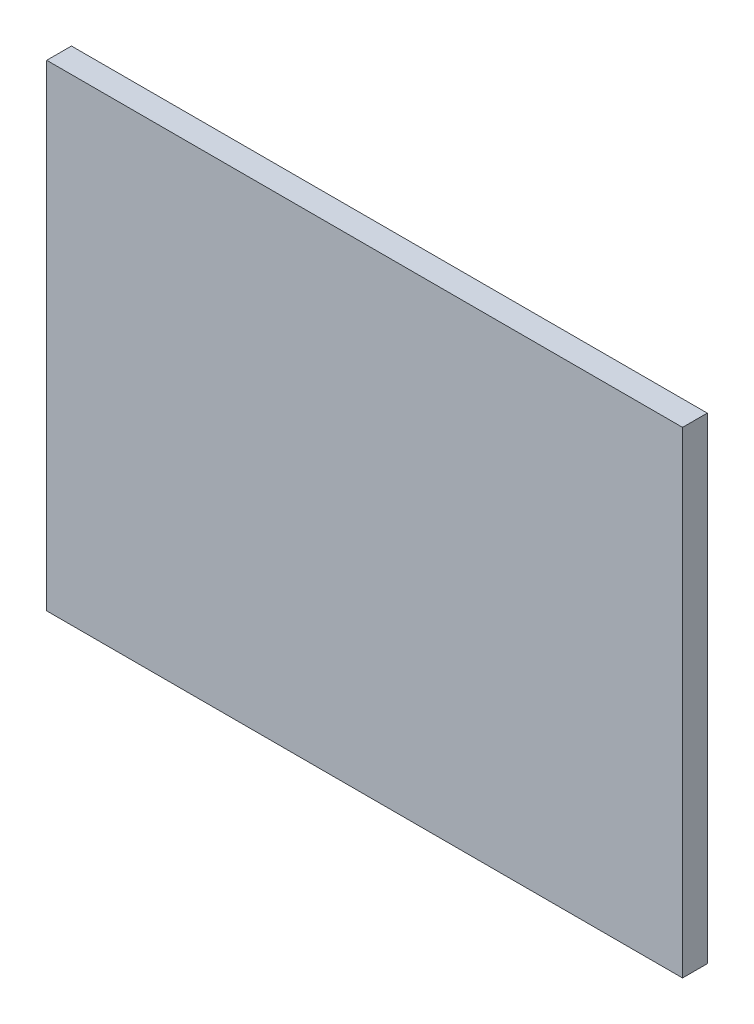
ISO-10303-21;
HEADER;
FILE_DESCRIPTION(('STEP AP214'),'2;1');
FILE_NAME('part.step','',(''),(''),'','','');
FILE_SCHEMA(('AUTOMOTIVE_DESIGN { 1 0 10303 214 1 1 1 1 }'));
ENDSEC;
DATA;
#1=APPLICATION_CONTEXT('core data for automotive mechanical design processes');
#2=APPLICATION_PROTOCOL_DEFINITION('international standard','automotive_design',2000,#1);
#3=PRODUCT_CONTEXT('',#1,'mechanical');
#4=PRODUCT('Part','Part','',(#3));
#5=PRODUCT_RELATED_PRODUCT_CATEGORY('part','',(#4));
#6=PRODUCT_DEFINITION_FORMATION('','',#4);
#7=PRODUCT_DEFINITION_CONTEXT('part definition',#1,'design');
#8=PRODUCT_DEFINITION('design','',#6,#7);
#9=PRODUCT_DEFINITION_SHAPE('','',#8);
#10=(LENGTH_UNIT() NAMED_UNIT(*) SI_UNIT(.MILLI.,.METRE.));
#11=(NAMED_UNIT(*) PLANE_ANGLE_UNIT() SI_UNIT($,.RADIAN.));
#12=(NAMED_UNIT(*) SI_UNIT($,.STERADIAN.) SOLID_ANGLE_UNIT());
#13=UNCERTAINTY_MEASURE_WITH_UNIT(LENGTH_MEASURE(1.E-05),#10,'distance_accuracy_value','');
#14=(GEOMETRIC_REPRESENTATION_CONTEXT(3) GLOBAL_UNCERTAINTY_ASSIGNED_CONTEXT((#13)) GLOBAL_UNIT_ASSIGNED_CONTEXT((#10,
#11,#12)) REPRESENTATION_CONTEXT('',''));
#15=CARTESIAN_POINT('',(0.,0.,0.));
#16=DIRECTION('',(0.,0.,1.));
#17=DIRECTION('',(1.,0.,0.));
#18=AXIS2_PLACEMENT_3D('',#15,#16,#17);
#19=CARTESIAN_POINT('',(0.,0.,0.07));
#20=DIRECTION('',(0.,0.,1.));
#21=DIRECTION('',(1.,0.,0.));
#22=AXIS2_PLACEMENT_3D('',#19,#20,#21);
#23=PLANE('',#22);
#24=DIRECTION('',(0.,1.,0.));
#25=VECTOR('',#24,1.);
#26=CARTESIAN_POINT('',(0.,0.,0.07));
#27=LINE('',#26,#25);
#28=CARTESIAN_POINT('',(0.,0.,0.07));
#29=VERTEX_POINT('',#28);
#30=CARTESIAN_POINT('',(0.,1.35,0.07));
#31=VERTEX_POINT('',#30);
#32=EDGE_CURVE('E88',#29,#31,#27,.T.);
#33=ORIENTED_EDGE('',*,*,#32,.F.);
#34=DIRECTION('',(1.,0.,0.));
#35=VECTOR('',#34,1.);
#36=CARTESIAN_POINT('',(0.,0.,0.07));
#37=LINE('',#36,#35);
#38=CARTESIAN_POINT('',(1.8,0.,0.07));
#39=VERTEX_POINT('',#38);
#40=EDGE_CURVE('E70',#29,#39,#37,.T.);
#41=ORIENTED_EDGE('',*,*,#40,.T.);
#42=DIRECTION('',(0.,1.,0.));
#43=VECTOR('',#42,1.);
#44=CARTESIAN_POINT('',(1.8,0.,0.07));
#45=LINE('',#44,#43);
#46=CARTESIAN_POINT('',(1.8,1.35,0.07));
#47=VERTEX_POINT('',#46);
#48=EDGE_CURVE('E82',#39,#47,#45,.T.);
#49=ORIENTED_EDGE('',*,*,#48,.T.);
#50=DIRECTION('',(1.,0.,0.));
#51=VECTOR('',#50,1.);
#52=CARTESIAN_POINT('',(0.,1.35,0.07));
#53=LINE('',#52,#51);
#54=EDGE_CURVE('E11',#31,#47,#53,.T.);
#55=ORIENTED_EDGE('',*,*,#54,.F.);
#56=EDGE_LOOP('',(#33,#41,#49,#55));
#57=FACE_BOUND('',#56,.T.);
#58=ADVANCED_FACE('F17',(#57),#23,.T.);
#59=CARTESIAN_POINT('',(0.,0.,0.));
#60=DIRECTION('',(0.,0.,1.));
#61=DIRECTION('',(1.,0.,0.));
#62=AXIS2_PLACEMENT_3D('',#59,#60,#61);
#63=PLANE('',#62);
#64=DIRECTION('',(1.,0.,0.));
#65=VECTOR('',#64,1.);
#66=CARTESIAN_POINT('',(0.,1.35,0.));
#67=LINE('',#66,#65);
#68=CARTESIAN_POINT('',(0.,1.35,0.));
#69=VERTEX_POINT('',#68);
#70=CARTESIAN_POINT('',(1.8,1.35,0.));
#71=VERTEX_POINT('',#70);
#72=EDGE_CURVE('E26',#69,#71,#67,.T.);
#73=ORIENTED_EDGE('',*,*,#72,.T.);
#74=DIRECTION('',(0.,1.,0.));
#75=VECTOR('',#74,1.);
#76=CARTESIAN_POINT('',(1.8,0.,0.));
#77=LINE('',#76,#75);
#78=CARTESIAN_POINT('',(1.8,0.,0.));
#79=VERTEX_POINT('',#78);
#80=EDGE_CURVE('E108',#79,#71,#77,.T.);
#81=ORIENTED_EDGE('',*,*,#80,.F.);
#82=DIRECTION('',(1.,0.,0.));
#83=VECTOR('',#82,1.);
#84=CARTESIAN_POINT('',(0.,0.,0.));
#85=LINE('',#84,#83);
#86=CARTESIAN_POINT('',(0.,0.,0.));
#87=VERTEX_POINT('',#86);
#88=EDGE_CURVE('E81',#87,#79,#85,.T.);
#89=ORIENTED_EDGE('',*,*,#88,.F.);
#90=DIRECTION('',(0.,1.,0.));
#91=VECTOR('',#90,1.);
#92=CARTESIAN_POINT('',(0.,0.,0.));
#93=LINE('',#92,#91);
#94=EDGE_CURVE('E89',#87,#69,#93,.T.);
#95=ORIENTED_EDGE('',*,*,#94,.T.);
#96=EDGE_LOOP('',(#73,#81,#89,#95));
#97=FACE_BOUND('',#96,.T.);
#98=ADVANCED_FACE('F19',(#97),#63,.F.);
#99=CARTESIAN_POINT('',(0.,1.35,0.));
#100=DIRECTION('',(0.,1.,0.));
#101=DIRECTION('',(1.,0.,0.));
#102=AXIS2_PLACEMENT_3D('',#99,#100,#101);
#103=PLANE('',#102);
#104=ORIENTED_EDGE('',*,*,#72,.F.);
#105=DIRECTION('',(0.,0.,1.));
#106=VECTOR('',#105,1.);
#107=CARTESIAN_POINT('',(0.,1.35,0.));
#108=LINE('',#107,#106);
#109=EDGE_CURVE('E93',#69,#31,#108,.T.);
#110=ORIENTED_EDGE('',*,*,#109,.T.);
#111=ORIENTED_EDGE('',*,*,#54,.T.);
#112=DIRECTION('',(0.,0.,1.));
#113=VECTOR('',#112,1.);
#114=CARTESIAN_POINT('',(1.8,1.35,0.));
#115=LINE('',#114,#113);
#116=EDGE_CURVE('E104',#71,#47,#115,.T.);
#117=ORIENTED_EDGE('',*,*,#116,.F.);
#118=EDGE_LOOP('',(#104,#110,#111,#117));
#119=FACE_BOUND('',#118,.T.);
#120=ADVANCED_FACE('F154',(#119),#103,.T.);
#121=CARTESIAN_POINT('',(0.,0.,0.));
#122=DIRECTION('',(0.,1.,0.));
#123=DIRECTION('',(1.,0.,0.));
#124=AXIS2_PLACEMENT_3D('',#121,#122,#123);
#125=PLANE('',#124);
#126=DIRECTION('',(0.,0.,1.));
#127=VECTOR('',#126,1.);
#128=CARTESIAN_POINT('',(1.8,0.,0.));
#129=LINE('',#128,#127);
#130=EDGE_CURVE('E76',#79,#39,#129,.T.);
#131=ORIENTED_EDGE('',*,*,#130,.T.);
#132=ORIENTED_EDGE('',*,*,#40,.F.);
#133=DIRECTION('',(0.,0.,1.));
#134=VECTOR('',#133,1.);
#135=CARTESIAN_POINT('',(0.,0.,0.));
#136=LINE('',#135,#134);
#137=EDGE_CURVE('E73',#87,#29,#136,.T.);
#138=ORIENTED_EDGE('',*,*,#137,.F.);
#139=ORIENTED_EDGE('',*,*,#88,.T.);
#140=EDGE_LOOP('',(#131,#132,#138,#139));
#141=FACE_BOUND('',#140,.T.);
#142=ADVANCED_FACE('F72',(#141),#125,.F.);
#143=CARTESIAN_POINT('',(1.8,0.,0.));
#144=DIRECTION('',(1.,0.,0.));
#145=DIRECTION('',(0.,1.,0.));
#146=AXIS2_PLACEMENT_3D('',#143,#144,#145);
#147=PLANE('',#146);
#148=ORIENTED_EDGE('',*,*,#130,.F.);
#149=ORIENTED_EDGE('',*,*,#80,.T.);
#150=ORIENTED_EDGE('',*,*,#116,.T.);
#151=ORIENTED_EDGE('',*,*,#48,.F.);
#152=EDGE_LOOP('',(#148,#149,#150,#151));
#153=FACE_BOUND('',#152,.T.);
#154=ADVANCED_FACE('F133',(#153),#147,.T.);
#155=CARTESIAN_POINT('',(0.,0.,0.));
#156=DIRECTION('',(1.,0.,0.));
#157=DIRECTION('',(0.,1.,0.));
#158=AXIS2_PLACEMENT_3D('',#155,#156,#157);
#159=PLANE('',#158);
#160=ORIENTED_EDGE('',*,*,#32,.T.);
#161=ORIENTED_EDGE('',*,*,#109,.F.);
#162=ORIENTED_EDGE('',*,*,#94,.F.);
#163=ORIENTED_EDGE('',*,*,#137,.T.);
#164=EDGE_LOOP('',(#160,#161,#162,#163));
#165=FACE_BOUND('',#164,.T.);
#166=ADVANCED_FACE('F86',(#165),#159,.F.);
#167=CLOSED_SHELL('',(#58,#98,#120,#142,#154,#166));
#168=MANIFOLD_SOLID_BREP('B1',#167);
#169=ADVANCED_BREP_SHAPE_REPRESENTATION('',(#18,#168),#14);
#170=SHAPE_DEFINITION_REPRESENTATION(#9,#169);
ENDSEC;
END-ISO-10303-21;
